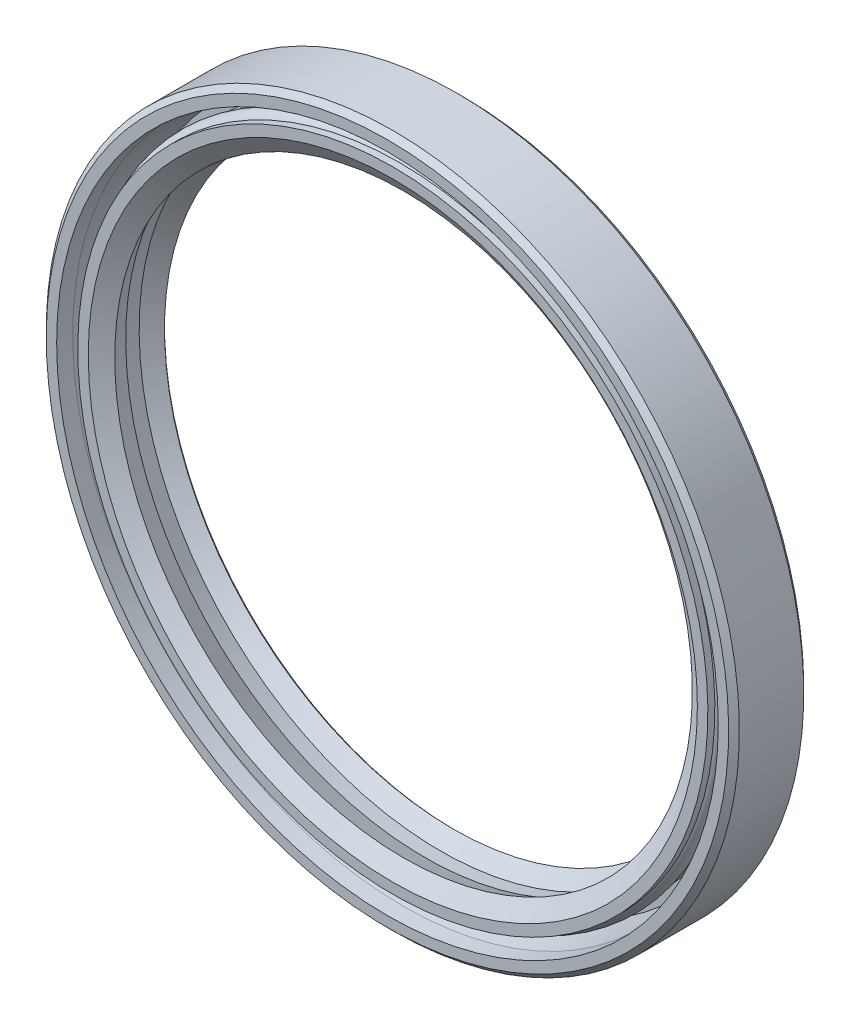
ISO-10303-21;
HEADER;
FILE_DESCRIPTION(('STEP AP214'),'2;1');
FILE_NAME('part.step','',(''),(''),'','','');
FILE_SCHEMA(('AUTOMOTIVE_DESIGN { 1 0 10303 214 1 1 1 1 }'));
ENDSEC;
DATA;
#1=APPLICATION_CONTEXT('core data for automotive mechanical design processes');
#2=APPLICATION_PROTOCOL_DEFINITION('international standard','automotive_design',2000,#1);
#3=PRODUCT_CONTEXT('',#1,'mechanical');
#4=PRODUCT('Part','Part','',(#3));
#5=PRODUCT_RELATED_PRODUCT_CATEGORY('part','',(#4));
#6=PRODUCT_DEFINITION_FORMATION('','',#4);
#7=PRODUCT_DEFINITION_CONTEXT('part definition',#1,'design');
#8=PRODUCT_DEFINITION('design','',#6,#7);
#9=PRODUCT_DEFINITION_SHAPE('','',#8);
#10=(LENGTH_UNIT() NAMED_UNIT(*) SI_UNIT(.MILLI.,.METRE.));
#11=(NAMED_UNIT(*) PLANE_ANGLE_UNIT() SI_UNIT($,.RADIAN.));
#12=(NAMED_UNIT(*) SI_UNIT($,.STERADIAN.) SOLID_ANGLE_UNIT());
#13=UNCERTAINTY_MEASURE_WITH_UNIT(LENGTH_MEASURE(1.E-05),#10,'distance_accuracy_value','');
#14=(GEOMETRIC_REPRESENTATION_CONTEXT(3) GLOBAL_UNCERTAINTY_ASSIGNED_CONTEXT((#13)) GLOBAL_UNIT_ASSIGNED_CONTEXT((#10,
#11,#12)) REPRESENTATION_CONTEXT('',''));
#15=CARTESIAN_POINT('',(0.,0.,0.));
#16=DIRECTION('',(0.,0.,1.));
#17=DIRECTION('',(1.,0.,0.));
#18=AXIS2_PLACEMENT_3D('',#15,#16,#17);
#19=CARTESIAN_POINT('',(0.,0.,0.));
#20=DIRECTION('',(0.,0.,-1.));
#21=DIRECTION('',(0.,1.,0.));
#22=AXIS2_PLACEMENT_3D('',#19,#20,#21);
#23=CYLINDRICAL_SURFACE('',#22,57.2727272727273);
#24=CARTESIAN_POINT('',(0.,0.,10.2142857142857));
#25=DIRECTION('',(0.,0.,-1.));
#26=DIRECTION('',(0.,1.,0.));
#27=AXIS2_PLACEMENT_3D('',#24,#25,#26);
#28=CIRCLE('',#27,57.2727272727273);
#29=CARTESIAN_POINT('',(0.,57.2727272727273,10.2142857142857));
#30=VERTEX_POINT('',#29);
#31=EDGE_CURVE('E91',#30,#30,#28,.T.);
#32=ORIENTED_EDGE('',*,*,#31,.T.);
#33=EDGE_LOOP('',(#32));
#34=FACE_BOUND('',#33,.T.);
#35=CARTESIAN_POINT('',(0.,0.,13.));
#36=DIRECTION('',(0.,0.,-1.));
#37=DIRECTION('',(0.,1.,0.));
#38=AXIS2_PLACEMENT_3D('',#35,#36,#37);
#39=CIRCLE('',#38,57.2727272727273);
#40=CARTESIAN_POINT('',(0.,57.2727272727273,13.));
#41=VERTEX_POINT('',#40);
#42=EDGE_CURVE('E10',#41,#41,#39,.T.);
#43=ORIENTED_EDGE('',*,*,#42,.F.);
#44=EDGE_LOOP('',(#43));
#45=FACE_BOUND('',#44,.T.);
#46=ADVANCED_FACE('F30',(#34,#45),#23,.F.);
#47=CARTESIAN_POINT('',(0.,59.0714285714286,13.));
#48=DIRECTION('',(0.,0.,1.));
#49=DIRECTION('',(0.,-1.,0.));
#50=AXIS2_PLACEMENT_3D('',#47,#48,#49);
#51=PLANE('',#50);
#52=ORIENTED_EDGE('',*,*,#42,.T.);
#53=EDGE_LOOP('',(#52));
#54=FACE_BOUND('',#53,.T.);
#55=CARTESIAN_POINT('',(0.,0.,13.));
#56=DIRECTION('',(0.,0.,-1.));
#57=DIRECTION('',(0.,1.,0.));
#58=AXIS2_PLACEMENT_3D('',#55,#56,#57);
#59=CIRCLE('',#58,59.0714285714286);
#60=CARTESIAN_POINT('',(0.,59.0714285714286,13.));
#61=VERTEX_POINT('',#60);
#62=EDGE_CURVE('E36',#61,#61,#59,.T.);
#63=ORIENTED_EDGE('',*,*,#62,.F.);
#64=EDGE_LOOP('',(#63));
#65=FACE_BOUND('',#64,.T.);
#66=ADVANCED_FACE('F109',(#54,#65),#51,.T.);
#67=CARTESIAN_POINT('',(0.,0.,12.0714285714286));
#68=DIRECTION('',(0.,0.,-1.));
#69=DIRECTION('',(0.,1.,0.));
#70=AXIS2_PLACEMENT_3D('',#67,#68,#69);
#71=CONICAL_SURFACE('',#70,60.,0.785398163397451);
#72=ORIENTED_EDGE('',*,*,#62,.T.);
#73=EDGE_LOOP('',(#72));
#74=FACE_BOUND('',#73,.T.);
#75=CARTESIAN_POINT('',(0.,0.,12.0714285714286));
#76=DIRECTION('',(0.,0.,-1.));
#77=DIRECTION('',(0.,1.,0.));
#78=AXIS2_PLACEMENT_3D('',#75,#76,#77);
#79=CIRCLE('',#78,60.);
#80=CARTESIAN_POINT('',(0.,60.,12.0714285714286));
#81=VERTEX_POINT('',#80);
#82=EDGE_CURVE('E40',#81,#81,#79,.T.);
#83=ORIENTED_EDGE('',*,*,#82,.F.);
#84=EDGE_LOOP('',(#83));
#85=FACE_BOUND('',#84,.T.);
#86=ADVANCED_FACE('F113',(#74,#85),#71,.T.);
#87=CARTESIAN_POINT('',(0.,0.,0.));
#88=DIRECTION('',(0.,0.,-1.));
#89=DIRECTION('',(0.,1.,0.));
#90=AXIS2_PLACEMENT_3D('',#87,#88,#89);
#91=CYLINDRICAL_SURFACE('',#90,60.);
#92=ORIENTED_EDGE('',*,*,#82,.T.);
#93=EDGE_LOOP('',(#92));
#94=FACE_BOUND('',#93,.T.);
#95=CARTESIAN_POINT('',(0.,0.,0.928571428571421));
#96=DIRECTION('',(0.,0.,-1.));
#97=DIRECTION('',(0.,1.,0.));
#98=AXIS2_PLACEMENT_3D('',#95,#96,#97);
#99=CIRCLE('',#98,60.);
#100=CARTESIAN_POINT('',(0.,60.,0.928571428571429));
#101=VERTEX_POINT('',#100);
#102=EDGE_CURVE('E44',#101,#101,#99,.T.);
#103=ORIENTED_EDGE('',*,*,#102,.F.);
#104=EDGE_LOOP('',(#103));
#105=FACE_BOUND('',#104,.T.);
#106=ADVANCED_FACE('F117',(#94,#105),#91,.T.);
#107=CARTESIAN_POINT('',(0.,0.,0.));
#108=DIRECTION('',(0.,0.,1.));
#109=DIRECTION('',(0.,-1.,0.));
#110=AXIS2_PLACEMENT_3D('',#107,#108,#109);
#111=CONICAL_SURFACE('',#110,59.0714285714286,0.785398163397452);
#112=ORIENTED_EDGE('',*,*,#102,.T.);
#113=EDGE_LOOP('',(#112));
#114=FACE_BOUND('',#113,.T.);
#115=CARTESIAN_POINT('',(0.,0.,0.));
#116=DIRECTION('',(0.,0.,-1.));
#117=DIRECTION('',(0.,1.,0.));
#118=AXIS2_PLACEMENT_3D('',#115,#116,#117);
#119=CIRCLE('',#118,59.0714285714286);
#120=CARTESIAN_POINT('',(0.,59.0714285714286,0.));
#121=VERTEX_POINT('',#120);
#122=EDGE_CURVE('E49',#121,#121,#119,.T.);
#123=ORIENTED_EDGE('',*,*,#122,.F.);
#124=EDGE_LOOP('',(#123));
#125=FACE_BOUND('',#124,.T.);
#126=ADVANCED_FACE('F123',(#114,#125),#111,.T.);
#127=CARTESIAN_POINT('',(0.,59.0714285714286,0.));
#128=DIRECTION('',(0.,0.,-1.));
#129=DIRECTION('',(0.,1.,0.));
#130=AXIS2_PLACEMENT_3D('',#127,#128,#129);
#131=PLANE('',#130);
#132=ORIENTED_EDGE('',*,*,#122,.T.);
#133=EDGE_LOOP('',(#132));
#134=FACE_BOUND('',#133,.T.);
#135=CARTESIAN_POINT('',(0.,0.,0.));
#136=DIRECTION('',(0.,0.,-1.));
#137=DIRECTION('',(0.,1.,0.));
#138=AXIS2_PLACEMENT_3D('',#135,#136,#137);
#139=CIRCLE('',#138,52.7272727272727);
#140=CARTESIAN_POINT('',(0.,52.7272727272727,0.));
#141=VERTEX_POINT('',#140);
#142=EDGE_CURVE('E52',#141,#141,#139,.T.);
#143=ORIENTED_EDGE('',*,*,#142,.F.);
#144=EDGE_LOOP('',(#143));
#145=FACE_BOUND('',#144,.T.);
#146=ADVANCED_FACE('F127',(#134,#145),#131,.T.);
#147=CARTESIAN_POINT('',(0.,0.,1.92442191338072));
#148=DIRECTION('',(0.,0.,-1.));
#149=DIRECTION('',(0.,1.,0.));
#150=AXIS2_PLACEMENT_3D('',#147,#148,#149);
#151=CONICAL_SURFACE('',#150,52.4581228093174,0.138958767271684);
#152=ORIENTED_EDGE('',*,*,#142,.T.);
#153=EDGE_LOOP('',(#152));
#154=FACE_BOUND('',#153,.T.);
#155=CARTESIAN_POINT('',(0.,0.,1.92442191338072));
#156=DIRECTION('',(0.,0.,-1.));
#157=DIRECTION('',(0.,1.,0.));
#158=AXIS2_PLACEMENT_3D('',#155,#156,#157);
#159=CIRCLE('',#158,52.4581228093174);
#160=CARTESIAN_POINT('',(0.,52.4581228093174,1.92442191338073));
#161=VERTEX_POINT('',#160);
#162=EDGE_CURVE('E55',#161,#161,#159,.T.);
#163=ORIENTED_EDGE('',*,*,#162,.F.);
#164=EDGE_LOOP('',(#163));
#165=FACE_BOUND('',#164,.T.);
#166=ADVANCED_FACE('F131',(#154,#165),#151,.F.);
#167=CARTESIAN_POINT('',(0.,0.,1.18181818181818));
#168=DIRECTION('',(0.,0.,1.));
#169=DIRECTION('',(0.,-1.,0.));
#170=AXIS2_PLACEMENT_3D('',#167,#168,#169);
#171=CONICAL_SURFACE('',#170,50.4178358252466,1.22173047639602);
#172=ORIENTED_EDGE('',*,*,#162,.T.);
#173=EDGE_LOOP('',(#172));
#174=FACE_BOUND('',#173,.T.);
#175=CARTESIAN_POINT('',(0.,0.,1.18181818181818));
#176=DIRECTION('',(0.,0.,-1.));
#177=DIRECTION('',(0.,1.,0.));
#178=AXIS2_PLACEMENT_3D('',#175,#176,#177);
#179=CIRCLE('',#178,50.4178358252466);
#180=CARTESIAN_POINT('',(0.,50.4178358252466,1.18181818181818));
#181=VERTEX_POINT('',#180);
#182=EDGE_CURVE('E58',#181,#181,#179,.T.);
#183=ORIENTED_EDGE('',*,*,#182,.F.);
#184=EDGE_LOOP('',(#183));
#185=FACE_BOUND('',#184,.T.);
#186=ADVANCED_FACE('F135',(#174,#185),#171,.T.);
#187=CARTESIAN_POINT('',(0.,0.,1.59965400706477));
#188=DIRECTION('',(0.,0.,-1.));
#189=DIRECTION('',(0.,1.,0.));
#190=AXIS2_PLACEMENT_3D('',#187,#188,#189);
#191=CONICAL_SURFACE('',#190,50.,0.785398163397451);
#192=ORIENTED_EDGE('',*,*,#182,.T.);
#193=EDGE_LOOP('',(#192));
#194=FACE_BOUND('',#193,.T.);
#195=CARTESIAN_POINT('',(0.,0.,1.59965400706477));
#196=DIRECTION('',(0.,0.,-1.));
#197=DIRECTION('',(0.,1.,0.));
#198=AXIS2_PLACEMENT_3D('',#195,#196,#197);
#199=CIRCLE('',#198,50.);
#200=CARTESIAN_POINT('',(0.,50.,1.59965400706478));
#201=VERTEX_POINT('',#200);
#202=EDGE_CURVE('E61',#201,#201,#199,.T.);
#203=ORIENTED_EDGE('',*,*,#202,.F.);
#204=EDGE_LOOP('',(#203));
#205=FACE_BOUND('',#204,.T.);
#206=ADVANCED_FACE('F139',(#194,#205),#191,.F.);
#207=CARTESIAN_POINT('',(0.,0.,3.79601547859058));
#208=DIRECTION('',(0.,0.,1.));
#209=DIRECTION('',(0.,-1.,0.));
#210=AXIS2_PLACEMENT_3D('',#207,#208,#209);
#211=CONICAL_SURFACE('',#210,52.1963614715258,0.785398163397445);
#212=ORIENTED_EDGE('',*,*,#202,.T.);
#213=EDGE_LOOP('',(#212));
#214=FACE_BOUND('',#213,.T.);
#215=CARTESIAN_POINT('',(0.,0.,3.79601547859058));
#216=DIRECTION('',(0.,0.,-1.));
#217=DIRECTION('',(0.,1.,0.));
#218=AXIS2_PLACEMENT_3D('',#215,#216,#217);
#219=CIRCLE('',#218,52.1963614715258);
#220=CARTESIAN_POINT('',(0.,52.1963614715258,3.79601547859059));
#221=VERTEX_POINT('',#220);
#222=EDGE_CURVE('E64',#221,#221,#219,.T.);
#223=ORIENTED_EDGE('',*,*,#222,.F.);
#224=EDGE_LOOP('',(#223));
#225=FACE_BOUND('',#224,.T.);
#226=ADVANCED_FACE('F143',(#214,#225),#211,.F.);
#227=CARTESIAN_POINT('',(0.,0.,6.5));
#228=DIRECTION('',(0.,0.,-1.));
#229=DIRECTION('',(0.,1.,0.));
#230=AXIS2_PLACEMENT_3D('',#227,#228,#229);
#231=CONICAL_SURFACE('',#230,51.8181818181818,0.138958767271681);
#232=ORIENTED_EDGE('',*,*,#222,.T.);
#233=EDGE_LOOP('',(#232));
#234=FACE_BOUND('',#233,.T.);
#235=CARTESIAN_POINT('',(0.,0.,6.5));
#236=DIRECTION('',(0.,0.,-1.));
#237=DIRECTION('',(0.,1.,0.));
#238=AXIS2_PLACEMENT_3D('',#235,#236,#237);
#239=CIRCLE('',#238,51.8181818181818);
#240=CARTESIAN_POINT('',(0.,51.8181818181818,6.5));
#241=VERTEX_POINT('',#240);
#242=EDGE_CURVE('E67',#241,#241,#239,.T.);
#243=ORIENTED_EDGE('',*,*,#242,.F.);
#244=EDGE_LOOP('',(#243));
#245=FACE_BOUND('',#244,.T.);
#246=ADVANCED_FACE('F147',(#234,#245),#231,.F.);
#247=CARTESIAN_POINT('',(0.,0.,10.2142857142857));
#248=DIRECTION('',(0.,0.,-1.));
#249=DIRECTION('',(0.,1.,0.));
#250=AXIS2_PLACEMENT_3D('',#247,#248,#249);
#251=CONICAL_SURFACE('',#250,50.,0.45522084217703);
#252=ORIENTED_EDGE('',*,*,#242,.T.);
#253=EDGE_LOOP('',(#252));
#254=FACE_BOUND('',#253,.T.);
#255=CARTESIAN_POINT('',(0.,0.,10.2142857142857));
#256=DIRECTION('',(0.,0.,-1.));
#257=DIRECTION('',(0.,1.,0.));
#258=AXIS2_PLACEMENT_3D('',#255,#256,#257);
#259=CIRCLE('',#258,50.);
#260=CARTESIAN_POINT('',(0.,50.,10.2142857142857));
#261=VERTEX_POINT('',#260);
#262=EDGE_CURVE('E70',#261,#261,#259,.T.);
#263=ORIENTED_EDGE('',*,*,#262,.F.);
#264=EDGE_LOOP('',(#263));
#265=FACE_BOUND('',#264,.T.);
#266=ADVANCED_FACE('F151',(#254,#265),#251,.F.);
#267=CARTESIAN_POINT('',(0.,0.,12.0714285714286));
#268=DIRECTION('',(0.,0.,1.));
#269=DIRECTION('',(0.,-1.,0.));
#270=AXIS2_PLACEMENT_3D('',#267,#268,#269);
#271=CONICAL_SURFACE('',#270,52.7272727272727,0.972968711887513);
#272=ORIENTED_EDGE('',*,*,#262,.T.);
#273=EDGE_LOOP('',(#272));
#274=FACE_BOUND('',#273,.T.);
#275=CARTESIAN_POINT('',(0.,0.,12.0714285714286));
#276=DIRECTION('',(0.,0.,-1.));
#277=DIRECTION('',(0.,1.,0.));
#278=AXIS2_PLACEMENT_3D('',#275,#276,#277);
#279=CIRCLE('',#278,52.7272727272727);
#280=CARTESIAN_POINT('',(0.,52.7272727272727,12.0714285714286));
#281=VERTEX_POINT('',#280);
#282=EDGE_CURVE('E73',#281,#281,#279,.T.);
#283=ORIENTED_EDGE('',*,*,#282,.F.);
#284=EDGE_LOOP('',(#283));
#285=FACE_BOUND('',#284,.T.);
#286=ADVANCED_FACE('F155',(#274,#285),#271,.F.);
#287=CARTESIAN_POINT('',(0.,54.5454545454545,12.0714285714286));
#288=DIRECTION('',(0.,0.,1.));
#289=DIRECTION('',(0.,-1.,0.));
#290=AXIS2_PLACEMENT_3D('',#287,#288,#289);
#291=PLANE('',#290);
#292=ORIENTED_EDGE('',*,*,#282,.T.);
#293=EDGE_LOOP('',(#292));
#294=FACE_BOUND('',#293,.T.);
#295=CARTESIAN_POINT('',(0.,0.,12.0714285714286));
#296=DIRECTION('',(0.,0.,-1.));
#297=DIRECTION('',(0.,1.,0.));
#298=AXIS2_PLACEMENT_3D('',#295,#296,#297);
#299=CIRCLE('',#298,54.5454545454545);
#300=CARTESIAN_POINT('',(0.,54.5454545454545,12.0714285714286));
#301=VERTEX_POINT('',#300);
#302=EDGE_CURVE('E76',#301,#301,#299,.T.);
#303=ORIENTED_EDGE('',*,*,#302,.F.);
#304=EDGE_LOOP('',(#303));
#305=FACE_BOUND('',#304,.T.);
#306=ADVANCED_FACE('F159',(#294,#305),#291,.T.);
#307=CARTESIAN_POINT('',(0.,0.,0.));
#308=DIRECTION('',(0.,0.,-1.));
#309=DIRECTION('',(0.,1.,0.));
#310=AXIS2_PLACEMENT_3D('',#307,#308,#309);
#311=CYLINDRICAL_SURFACE('',#310,54.5454545454545);
#312=ORIENTED_EDGE('',*,*,#302,.T.);
#313=EDGE_LOOP('',(#312));
#314=FACE_BOUND('',#313,.T.);
#315=CARTESIAN_POINT('',(0.,0.,10.8603059289587));
#316=DIRECTION('',(0.,0.,-1.));
#317=DIRECTION('',(0.,1.,0.));
#318=AXIS2_PLACEMENT_3D('',#315,#316,#317);
#319=CIRCLE('',#318,54.5454545454545);
#320=CARTESIAN_POINT('',(0.,54.5454545454545,10.8603059289587));
#321=VERTEX_POINT('',#320);
#322=EDGE_CURVE('E79',#321,#321,#319,.T.);
#323=ORIENTED_EDGE('',*,*,#322,.F.);
#324=EDGE_LOOP('',(#323));
#325=FACE_BOUND('',#324,.T.);
#326=ADVANCED_FACE('F163',(#314,#325),#311,.T.);
#327=CARTESIAN_POINT('',(0.,0.,9.28571428571428));
#328=DIRECTION('',(0.,0.,-1.));
#329=DIRECTION('',(0.,1.,0.));
#330=AXIS2_PLACEMENT_3D('',#327,#328,#329);
#331=TOROIDAL_SURFACE('',#330,53.6363636363636,1.81818181818182);
#332=ORIENTED_EDGE('',*,*,#322,.T.);
#333=EDGE_LOOP('',(#332));
#334=FACE_BOUND('',#333,.T.);
#335=CARTESIAN_POINT('',(0.,0.,7.71112264246984));
#336=DIRECTION('',(0.,0.,-1.));
#337=DIRECTION('',(0.,1.,0.));
#338=AXIS2_PLACEMENT_3D('',#335,#336,#337);
#339=CIRCLE('',#338,54.5454545454545);
#340=CARTESIAN_POINT('',(0.,54.5454545454545,7.71112264246985));
#341=VERTEX_POINT('',#340);
#342=EDGE_CURVE('E82',#341,#341,#339,.T.);
#343=ORIENTED_EDGE('',*,*,#342,.F.);
#344=EDGE_LOOP('',(#343));
#345=FACE_BOUND('',#344,.T.);
#346=ADVANCED_FACE('F167',(#334,#345),#331,.T.);
#347=CARTESIAN_POINT('',(0.,0.,0.));
#348=DIRECTION('',(0.,0.,-1.));
#349=DIRECTION('',(0.,1.,0.));
#350=AXIS2_PLACEMENT_3D('',#347,#348,#349);
#351=CYLINDRICAL_SURFACE('',#350,54.5454545454545);
#352=ORIENTED_EDGE('',*,*,#342,.T.);
#353=EDGE_LOOP('',(#352));
#354=FACE_BOUND('',#353,.T.);
#355=CARTESIAN_POINT('',(0.,0.,2.78571428571428));
#356=DIRECTION('',(0.,0.,-1.));
#357=DIRECTION('',(0.,1.,0.));
#358=AXIS2_PLACEMENT_3D('',#355,#356,#357);
#359=CIRCLE('',#358,54.5454545454545);
#360=CARTESIAN_POINT('',(0.,54.5454545454545,2.78571428571429));
#361=VERTEX_POINT('',#360);
#362=EDGE_CURVE('E85',#361,#361,#359,.T.);
#363=ORIENTED_EDGE('',*,*,#362,.F.);
#364=EDGE_LOOP('',(#363));
#365=FACE_BOUND('',#364,.T.);
#366=ADVANCED_FACE('F105',(#354,#365),#351,.T.);
#367=CARTESIAN_POINT('',(0.,56.3636363636364,2.78571428571429));
#368=DIRECTION('',(0.,0.,1.));
#369=DIRECTION('',(0.,-1.,0.));
#370=AXIS2_PLACEMENT_3D('',#367,#368,#369);
#371=PLANE('',#370);
#372=ORIENTED_EDGE('',*,*,#362,.T.);
#373=EDGE_LOOP('',(#372));
#374=FACE_BOUND('',#373,.T.);
#375=CARTESIAN_POINT('',(0.,0.,2.78571428571428));
#376=DIRECTION('',(0.,0.,-1.));
#377=DIRECTION('',(0.,1.,0.));
#378=AXIS2_PLACEMENT_3D('',#375,#376,#377);
#379=CIRCLE('',#378,56.3636363636364);
#380=CARTESIAN_POINT('',(0.,56.3636363636364,2.78571428571429));
#381=VERTEX_POINT('',#380);
#382=EDGE_CURVE('E88',#381,#381,#379,.T.);
#383=ORIENTED_EDGE('',*,*,#382,.F.);
#384=EDGE_LOOP('',(#383));
#385=FACE_BOUND('',#384,.T.);
#386=ADVANCED_FACE('F99',(#374,#385),#371,.T.);
#387=CARTESIAN_POINT('',(0.,0.,10.2142857142857));
#388=DIRECTION('',(0.,0.,1.));
#389=DIRECTION('',(0.,-1.,0.));
#390=AXIS2_PLACEMENT_3D('',#387,#388,#389);
#391=CONICAL_SURFACE('',#390,57.2727272727273,0.121772133307998);
#392=ORIENTED_EDGE('',*,*,#382,.T.);
#393=EDGE_LOOP('',(#392));
#394=FACE_BOUND('',#393,.T.);
#395=ORIENTED_EDGE('',*,*,#31,.F.);
#396=EDGE_LOOP('',(#395));
#397=FACE_BOUND('',#396,.T.);
#398=ADVANCED_FACE('F97',(#394,#397),#391,.F.);
#399=CLOSED_SHELL('',(#46,#66,#86,#106,#126,#146,#166,#186,#206,#226,#246,#266,#286,#306,#326,
#346,#366,#386,#398));
#400=MANIFOLD_SOLID_BREP('B2',#399);
#401=ADVANCED_BREP_SHAPE_REPRESENTATION('',(#18,#400),#14);
#402=SHAPE_DEFINITION_REPRESENTATION(#9,#401);
ENDSEC;
END-ISO-10303-21;
